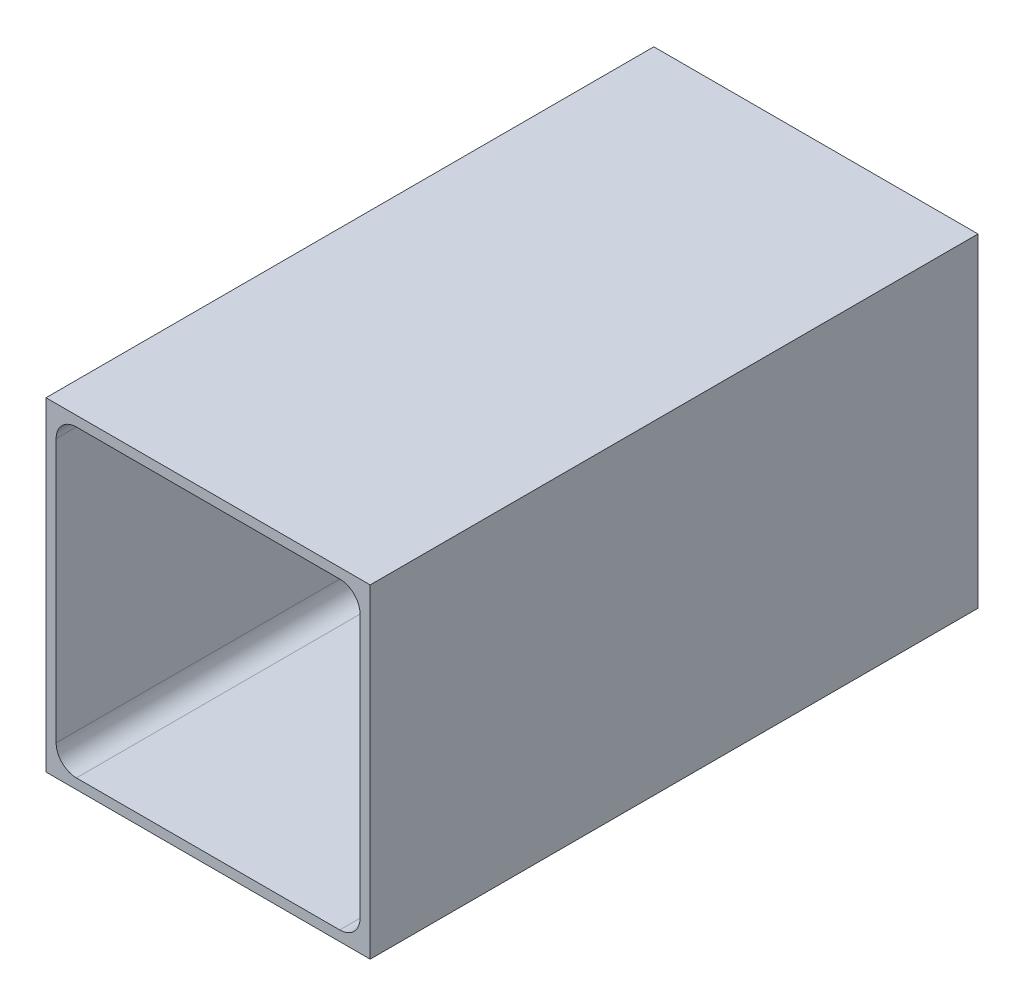
ISO-10303-21;
HEADER;
FILE_DESCRIPTION(('STEP AP214'),'2;1');
FILE_NAME('part.step','',(''),(''),'','','');
FILE_SCHEMA(('AUTOMOTIVE_DESIGN { 1 0 10303 214 1 1 1 1 }'));
ENDSEC;
DATA;
#1=APPLICATION_CONTEXT('core data for automotive mechanical design processes');
#2=APPLICATION_PROTOCOL_DEFINITION('international standard','automotive_design',2000,#1);
#3=PRODUCT_CONTEXT('',#1,'mechanical');
#4=PRODUCT('Part','Part','',(#3));
#5=PRODUCT_RELATED_PRODUCT_CATEGORY('part','',(#4));
#6=PRODUCT_DEFINITION_FORMATION('','',#4);
#7=PRODUCT_DEFINITION_CONTEXT('part definition',#1,'design');
#8=PRODUCT_DEFINITION('design','',#6,#7);
#9=PRODUCT_DEFINITION_SHAPE('','',#8);
#10=(LENGTH_UNIT() NAMED_UNIT(*) SI_UNIT(.MILLI.,.METRE.));
#11=(NAMED_UNIT(*) PLANE_ANGLE_UNIT() SI_UNIT($,.RADIAN.));
#12=(NAMED_UNIT(*) SI_UNIT($,.STERADIAN.) SOLID_ANGLE_UNIT());
#13=UNCERTAINTY_MEASURE_WITH_UNIT(LENGTH_MEASURE(1.E-05),#10,'distance_accuracy_value','');
#14=(GEOMETRIC_REPRESENTATION_CONTEXT(3) GLOBAL_UNCERTAINTY_ASSIGNED_CONTEXT((#13)) GLOBAL_UNIT_ASSIGNED_CONTEXT((#10,
#11,#12)) REPRESENTATION_CONTEXT('',''));
#15=CARTESIAN_POINT('',(0.,0.,0.));
#16=DIRECTION('',(0.,0.,1.));
#17=DIRECTION('',(1.,0.,0.));
#18=AXIS2_PLACEMENT_3D('',#15,#16,#17);
#19=CARTESIAN_POINT('',(0.,0.,3000.));
#20=DIRECTION('',(0.,0.,-1.));
#21=DIRECTION('',(-1.,0.,0.));
#22=AXIS2_PLACEMENT_3D('',#19,#20,#21);
#23=PLANE('',#22);
#24=DIRECTION('',(0.,-1.,0.));
#25=VECTOR('',#24,1.);
#26=CARTESIAN_POINT('',(-160.,0.,3000.));
#27=LINE('',#26,#25);
#28=CARTESIAN_POINT('',(-160.,160.,3000.));
#29=VERTEX_POINT('',#28);
#30=CARTESIAN_POINT('',(-160.,-160.,3000.));
#31=VERTEX_POINT('',#30);
#32=EDGE_CURVE('E145',#29,#31,#27,.T.);
#33=ORIENTED_EDGE('',*,*,#32,.T.);
#34=DIRECTION('',(1.,0.,0.));
#35=VECTOR('',#34,1.);
#36=CARTESIAN_POINT('',(0.,-160.,3000.));
#37=LINE('',#36,#35);
#38=CARTESIAN_POINT('',(160.,-160.,3000.));
#39=VERTEX_POINT('',#38);
#40=EDGE_CURVE('E154',#31,#39,#37,.T.);
#41=ORIENTED_EDGE('',*,*,#40,.T.);
#42=DIRECTION('',(0.,1.,0.));
#43=VECTOR('',#42,1.);
#44=CARTESIAN_POINT('',(160.,0.,3000.));
#45=LINE('',#44,#43);
#46=CARTESIAN_POINT('',(160.,160.,3000.));
#47=VERTEX_POINT('',#46);
#48=EDGE_CURVE('E161',#39,#47,#45,.T.);
#49=ORIENTED_EDGE('',*,*,#48,.T.);
#50=DIRECTION('',(-1.,0.,0.));
#51=VECTOR('',#50,1.);
#52=CARTESIAN_POINT('',(0.,160.,3000.));
#53=LINE('',#52,#51);
#54=EDGE_CURVE('E164',#47,#29,#53,.T.);
#55=ORIENTED_EDGE('',*,*,#54,.T.);
#56=EDGE_LOOP('',(#33,#41,#49,#55));
#57=FACE_BOUND('',#56,.T.);
#58=DIRECTION('',(0.,-1.,0.));
#59=VECTOR('',#58,1.);
#60=CARTESIAN_POINT('',(-150.,-150.,3000.));
#61=LINE('',#60,#59);
#62=CARTESIAN_POINT('',(-150.,130.,3000.));
#63=VERTEX_POINT('',#62);
#64=CARTESIAN_POINT('',(-150.,-130.,3000.));
#65=VERTEX_POINT('',#64);
#66=EDGE_CURVE('E232',#63,#65,#61,.T.);
#67=ORIENTED_EDGE('',*,*,#66,.F.);
#68=CARTESIAN_POINT('',(-130.,130.,3000.));
#69=DIRECTION('',(0.,0.,-1.));
#70=DIRECTION('',(-1.,0.,0.));
#71=AXIS2_PLACEMENT_3D('',#68,#69,#70);
#72=CIRCLE('',#71,20.);
#73=CARTESIAN_POINT('',(-130.,150.,3000.));
#74=VERTEX_POINT('',#73);
#75=EDGE_CURVE('E220',#63,#74,#72,.T.);
#76=ORIENTED_EDGE('',*,*,#75,.T.);
#77=DIRECTION('',(-1.,0.,0.));
#78=VECTOR('',#77,1.);
#79=CARTESIAN_POINT('',(-150.,150.,3000.));
#80=LINE('',#79,#78);
#81=CARTESIAN_POINT('',(130.,150.,3000.));
#82=VERTEX_POINT('',#81);
#83=EDGE_CURVE('E200',#82,#74,#80,.T.);
#84=ORIENTED_EDGE('',*,*,#83,.F.);
#85=CARTESIAN_POINT('',(130.,130.,3000.));
#86=DIRECTION('',(0.,0.,-1.));
#87=DIRECTION('',(-1.,0.,0.));
#88=AXIS2_PLACEMENT_3D('',#85,#86,#87);
#89=CIRCLE('',#88,20.);
#90=CARTESIAN_POINT('',(150.,130.,3000.));
#91=VERTEX_POINT('',#90);
#92=EDGE_CURVE('E224',#82,#91,#89,.T.);
#93=ORIENTED_EDGE('',*,*,#92,.T.);
#94=DIRECTION('',(0.,1.,0.));
#95=VECTOR('',#94,1.);
#96=CARTESIAN_POINT('',(150.,-150.,3000.));
#97=LINE('',#96,#95);
#98=CARTESIAN_POINT('',(150.,-130.,3000.));
#99=VERTEX_POINT('',#98);
#100=EDGE_CURVE('E196',#99,#91,#97,.T.);
#101=ORIENTED_EDGE('',*,*,#100,.F.);
#102=CARTESIAN_POINT('',(130.,-130.,3000.));
#103=DIRECTION('',(0.,0.,-1.));
#104=DIRECTION('',(-1.,0.,0.));
#105=AXIS2_PLACEMENT_3D('',#102,#103,#104);
#106=CIRCLE('',#105,20.);
#107=CARTESIAN_POINT('',(130.,-150.,3000.));
#108=VERTEX_POINT('',#107);
#109=EDGE_CURVE('E66',#99,#108,#106,.T.);
#110=ORIENTED_EDGE('',*,*,#109,.T.);
#111=DIRECTION('',(1.,0.,0.));
#112=VECTOR('',#111,1.);
#113=CARTESIAN_POINT('',(-150.,-150.,3000.));
#114=LINE('',#113,#112);
#115=CARTESIAN_POINT('',(-130.,-150.,3000.));
#116=VERTEX_POINT('',#115);
#117=EDGE_CURVE('E182',#116,#108,#114,.T.);
#118=ORIENTED_EDGE('',*,*,#117,.F.);
#119=CARTESIAN_POINT('',(-130.,-130.,3000.));
#120=DIRECTION('',(0.,0.,-1.));
#121=DIRECTION('',(-1.,0.,0.));
#122=AXIS2_PLACEMENT_3D('',#119,#120,#121);
#123=CIRCLE('',#122,20.);
#124=EDGE_CURVE('E59',#116,#65,#123,.T.);
#125=ORIENTED_EDGE('',*,*,#124,.T.);
#126=EDGE_LOOP('',(#67,#76,#84,#93,#101,#110,#118,#125));
#127=FACE_BOUND('',#126,.T.);
#128=ADVANCED_FACE('F51',(#57,#127),#23,.F.);
#129=CARTESIAN_POINT('',(0.,0.,2400.));
#130=DIRECTION('',(0.,0.,1.));
#131=DIRECTION('',(1.,0.,0.));
#132=AXIS2_PLACEMENT_3D('',#129,#130,#131);
#133=PLANE('',#132);
#134=DIRECTION('',(1.,0.,0.));
#135=VECTOR('',#134,1.);
#136=CARTESIAN_POINT('',(0.,-160.,2400.));
#137=LINE('',#136,#135);
#138=CARTESIAN_POINT('',(-160.,-160.,2400.));
#139=VERTEX_POINT('',#138);
#140=CARTESIAN_POINT('',(160.,-160.,2400.));
#141=VERTEX_POINT('',#140);
#142=EDGE_CURVE('E180',#139,#141,#137,.T.);
#143=ORIENTED_EDGE('',*,*,#142,.F.);
#144=DIRECTION('',(0.,-1.,0.));
#145=VECTOR('',#144,1.);
#146=CARTESIAN_POINT('',(-160.,0.,2400.));
#147=LINE('',#146,#145);
#148=CARTESIAN_POINT('',(-160.,160.,2400.));
#149=VERTEX_POINT('',#148);
#150=EDGE_CURVE('E147',#149,#139,#147,.T.);
#151=ORIENTED_EDGE('',*,*,#150,.F.);
#152=DIRECTION('',(-1.,0.,0.));
#153=VECTOR('',#152,1.);
#154=CARTESIAN_POINT('',(0.,160.,2400.));
#155=LINE('',#154,#153);
#156=CARTESIAN_POINT('',(160.,160.,2400.));
#157=VERTEX_POINT('',#156);
#158=EDGE_CURVE('E174',#157,#149,#155,.T.);
#159=ORIENTED_EDGE('',*,*,#158,.F.);
#160=DIRECTION('',(0.,1.,0.));
#161=VECTOR('',#160,1.);
#162=CARTESIAN_POINT('',(160.,0.,2400.));
#163=LINE('',#162,#161);
#164=EDGE_CURVE('E177',#141,#157,#163,.T.);
#165=ORIENTED_EDGE('',*,*,#164,.F.);
#166=EDGE_LOOP('',(#143,#151,#159,#165));
#167=FACE_BOUND('',#166,.T.);
#168=DIRECTION('',(0.,-1.,0.));
#169=VECTOR('',#168,1.);
#170=CARTESIAN_POINT('',(-150.,-150.,2400.));
#171=LINE('',#170,#169);
#172=CARTESIAN_POINT('',(-150.,130.,2400.));
#173=VERTEX_POINT('',#172);
#174=CARTESIAN_POINT('',(-150.,-130.,2400.));
#175=VERTEX_POINT('',#174);
#176=EDGE_CURVE('E240',#173,#175,#171,.T.);
#177=ORIENTED_EDGE('',*,*,#176,.T.);
#178=CARTESIAN_POINT('',(-130.,-130.,2400.));
#179=DIRECTION('',(0.,0.,1.));
#180=DIRECTION('',(1.,0.,0.));
#181=AXIS2_PLACEMENT_3D('',#178,#179,#180);
#182=CIRCLE('',#181,20.);
#183=CARTESIAN_POINT('',(-130.,-150.,2400.));
#184=VERTEX_POINT('',#183);
#185=EDGE_CURVE('E12',#175,#184,#182,.T.);
#186=ORIENTED_EDGE('',*,*,#185,.T.);
#187=DIRECTION('',(1.,0.,0.));
#188=VECTOR('',#187,1.);
#189=CARTESIAN_POINT('',(-150.,-150.,2400.));
#190=LINE('',#189,#188);
#191=CARTESIAN_POINT('',(130.,-150.,2400.));
#192=VERTEX_POINT('',#191);
#193=EDGE_CURVE('E193',#184,#192,#190,.T.);
#194=ORIENTED_EDGE('',*,*,#193,.T.);
#195=CARTESIAN_POINT('',(130.,-130.,2400.));
#196=DIRECTION('',(0.,0.,1.));
#197=DIRECTION('',(1.,0.,0.));
#198=AXIS2_PLACEMENT_3D('',#195,#196,#197);
#199=CIRCLE('',#198,20.);
#200=CARTESIAN_POINT('',(150.,-130.,2400.));
#201=VERTEX_POINT('',#200);
#202=EDGE_CURVE('E229',#192,#201,#199,.T.);
#203=ORIENTED_EDGE('',*,*,#202,.T.);
#204=DIRECTION('',(0.,1.,0.));
#205=VECTOR('',#204,1.);
#206=CARTESIAN_POINT('',(150.,-150.,2400.));
#207=LINE('',#206,#205);
#208=CARTESIAN_POINT('',(150.,130.,2400.));
#209=VERTEX_POINT('',#208);
#210=EDGE_CURVE('E188',#201,#209,#207,.T.);
#211=ORIENTED_EDGE('',*,*,#210,.T.);
#212=CARTESIAN_POINT('',(130.,130.,2400.));
#213=DIRECTION('',(0.,0.,1.));
#214=DIRECTION('',(1.,0.,0.));
#215=AXIS2_PLACEMENT_3D('',#212,#213,#214);
#216=CIRCLE('',#215,20.);
#217=CARTESIAN_POINT('',(130.,150.,2400.));
#218=VERTEX_POINT('',#217);
#219=EDGE_CURVE('E226',#209,#218,#216,.T.);
#220=ORIENTED_EDGE('',*,*,#219,.T.);
#221=DIRECTION('',(-1.,0.,0.));
#222=VECTOR('',#221,1.);
#223=CARTESIAN_POINT('',(-150.,150.,2400.));
#224=LINE('',#223,#222);
#225=CARTESIAN_POINT('',(-130.,150.,2400.));
#226=VERTEX_POINT('',#225);
#227=EDGE_CURVE('E192',#218,#226,#224,.T.);
#228=ORIENTED_EDGE('',*,*,#227,.T.);
#229=CARTESIAN_POINT('',(-130.,130.,2400.));
#230=DIRECTION('',(0.,0.,1.));
#231=DIRECTION('',(1.,0.,0.));
#232=AXIS2_PLACEMENT_3D('',#229,#230,#231);
#233=CIRCLE('',#232,20.);
#234=EDGE_CURVE('E222',#226,#173,#233,.T.);
#235=ORIENTED_EDGE('',*,*,#234,.T.);
#236=EDGE_LOOP('',(#177,#186,#194,#203,#211,#220,#228,#235));
#237=FACE_BOUND('',#236,.T.);
#238=ADVANCED_FACE('F265',(#167,#237),#133,.F.);
#239=CARTESIAN_POINT('',(-160.,0.,0.));
#240=DIRECTION('',(1.,0.,0.));
#241=DIRECTION('',(0.,1.,0.));
#242=AXIS2_PLACEMENT_3D('',#239,#240,#241);
#243=PLANE('',#242);
#244=DIRECTION('',(0.,0.,1.));
#245=VECTOR('',#244,1.);
#246=CARTESIAN_POINT('',(-160.,-160.,0.));
#247=LINE('',#246,#245);
#248=EDGE_CURVE('E140',#139,#31,#247,.T.);
#249=ORIENTED_EDGE('',*,*,#248,.T.);
#250=ORIENTED_EDGE('',*,*,#32,.F.);
#251=DIRECTION('',(0.,0.,1.));
#252=VECTOR('',#251,1.);
#253=CARTESIAN_POINT('',(-160.,160.,0.));
#254=LINE('',#253,#252);
#255=EDGE_CURVE('E151',#149,#29,#254,.T.);
#256=ORIENTED_EDGE('',*,*,#255,.F.);
#257=ORIENTED_EDGE('',*,*,#150,.T.);
#258=EDGE_LOOP('',(#249,#250,#256,#257));
#259=FACE_BOUND('',#258,.T.);
#260=ADVANCED_FACE('F142',(#259),#243,.F.);
#261=CARTESIAN_POINT('',(0.,160.,0.));
#262=DIRECTION('',(0.,-1.,0.));
#263=DIRECTION('',(1.,0.,0.));
#264=AXIS2_PLACEMENT_3D('',#261,#262,#263);
#265=PLANE('',#264);
#266=ORIENTED_EDGE('',*,*,#255,.T.);
#267=ORIENTED_EDGE('',*,*,#54,.F.);
#268=DIRECTION('',(0.,0.,1.));
#269=VECTOR('',#268,1.);
#270=CARTESIAN_POINT('',(160.,160.,0.));
#271=LINE('',#270,#269);
#272=EDGE_CURVE('E165',#157,#47,#271,.T.);
#273=ORIENTED_EDGE('',*,*,#272,.F.);
#274=ORIENTED_EDGE('',*,*,#158,.T.);
#275=EDGE_LOOP('',(#266,#267,#273,#274));
#276=FACE_BOUND('',#275,.T.);
#277=ADVANCED_FACE('F299',(#276),#265,.F.);
#278=CARTESIAN_POINT('',(0.,-160.,0.));
#279=DIRECTION('',(0.,1.,0.));
#280=DIRECTION('',(-1.,0.,0.));
#281=AXIS2_PLACEMENT_3D('',#278,#279,#280);
#282=PLANE('',#281);
#283=DIRECTION('',(0.,0.,1.));
#284=VECTOR('',#283,1.);
#285=CARTESIAN_POINT('',(160.,-160.,0.));
#286=LINE('',#285,#284);
#287=EDGE_CURVE('E157',#141,#39,#286,.T.);
#288=ORIENTED_EDGE('',*,*,#287,.T.);
#289=ORIENTED_EDGE('',*,*,#40,.F.);
#290=ORIENTED_EDGE('',*,*,#248,.F.);
#291=ORIENTED_EDGE('',*,*,#142,.T.);
#292=EDGE_LOOP('',(#288,#289,#290,#291));
#293=FACE_BOUND('',#292,.T.);
#294=ADVANCED_FACE('F155',(#293),#282,.F.);
#295=CARTESIAN_POINT('',(160.,0.,0.));
#296=DIRECTION('',(-1.,0.,0.));
#297=DIRECTION('',(0.,-1.,0.));
#298=AXIS2_PLACEMENT_3D('',#295,#296,#297);
#299=PLANE('',#298);
#300=ORIENTED_EDGE('',*,*,#272,.T.);
#301=ORIENTED_EDGE('',*,*,#48,.F.);
#302=ORIENTED_EDGE('',*,*,#287,.F.);
#303=ORIENTED_EDGE('',*,*,#164,.T.);
#304=EDGE_LOOP('',(#300,#301,#302,#303));
#305=FACE_BOUND('',#304,.T.);
#306=ADVANCED_FACE('F305',(#305),#299,.F.);
#307=CARTESIAN_POINT('',(-150.,0.,0.));
#308=DIRECTION('',(1.,0.,0.));
#309=DIRECTION('',(0.,1.,0.));
#310=AXIS2_PLACEMENT_3D('',#307,#308,#309);
#311=PLANE('',#310);
#312=ORIENTED_EDGE('',*,*,#176,.F.);
#313=DIRECTION('',(0.,0.,1.));
#314=VECTOR('',#313,1.);
#315=CARTESIAN_POINT('',(-150.,130.,3000.));
#316=LINE('',#315,#314);
#317=EDGE_CURVE('E239',#173,#63,#316,.T.);
#318=ORIENTED_EDGE('',*,*,#317,.T.);
#319=ORIENTED_EDGE('',*,*,#66,.T.);
#320=DIRECTION('',(0.,0.,1.));
#321=VECTOR('',#320,1.);
#322=CARTESIAN_POINT('',(-150.,-130.,2400.));
#323=LINE('',#322,#321);
#324=EDGE_CURVE('E160',#65,#175,#323,.F.);
#325=ORIENTED_EDGE('',*,*,#324,.T.);
#326=EDGE_LOOP('',(#312,#318,#319,#325));
#327=FACE_BOUND('',#326,.T.);
#328=ADVANCED_FACE('F236',(#327),#311,.T.);
#329=CARTESIAN_POINT('',(0.,150.,0.));
#330=DIRECTION('',(0.,-1.,0.));
#331=DIRECTION('',(1.,0.,0.));
#332=AXIS2_PLACEMENT_3D('',#329,#330,#331);
#333=PLANE('',#332);
#334=ORIENTED_EDGE('',*,*,#83,.T.);
#335=DIRECTION('',(0.,0.,1.));
#336=VECTOR('',#335,1.);
#337=CARTESIAN_POINT('',(-130.,150.,2400.));
#338=LINE('',#337,#336);
#339=EDGE_CURVE('E194',#74,#226,#338,.F.);
#340=ORIENTED_EDGE('',*,*,#339,.T.);
#341=ORIENTED_EDGE('',*,*,#227,.F.);
#342=DIRECTION('',(0.,0.,1.));
#343=VECTOR('',#342,1.);
#344=CARTESIAN_POINT('',(130.,150.,3000.));
#345=LINE('',#344,#343);
#346=EDGE_CURVE('E244',#218,#82,#345,.T.);
#347=ORIENTED_EDGE('',*,*,#346,.T.);
#348=EDGE_LOOP('',(#334,#340,#341,#347));
#349=FACE_BOUND('',#348,.T.);
#350=ADVANCED_FACE('F269',(#349),#333,.T.);
#351=CARTESIAN_POINT('',(0.,-150.,0.));
#352=DIRECTION('',(0.,1.,0.));
#353=DIRECTION('',(-1.,0.,0.));
#354=AXIS2_PLACEMENT_3D('',#351,#352,#353);
#355=PLANE('',#354);
#356=ORIENTED_EDGE('',*,*,#117,.T.);
#357=DIRECTION('',(0.,0.,1.));
#358=VECTOR('',#357,1.);
#359=CARTESIAN_POINT('',(130.,-150.,2400.));
#360=LINE('',#359,#358);
#361=EDGE_CURVE('E217',#108,#192,#360,.F.);
#362=ORIENTED_EDGE('',*,*,#361,.T.);
#363=ORIENTED_EDGE('',*,*,#193,.F.);
#364=DIRECTION('',(0.,0.,1.));
#365=VECTOR('',#364,1.);
#366=CARTESIAN_POINT('',(-130.,-150.,3000.));
#367=LINE('',#366,#365);
#368=EDGE_CURVE('E215',#184,#116,#367,.T.);
#369=ORIENTED_EDGE('',*,*,#368,.T.);
#370=EDGE_LOOP('',(#356,#362,#363,#369));
#371=FACE_BOUND('',#370,.T.);
#372=ADVANCED_FACE('F277',(#371),#355,.T.);
#373=CARTESIAN_POINT('',(150.,0.,0.));
#374=DIRECTION('',(-1.,0.,0.));
#375=DIRECTION('',(0.,-1.,0.));
#376=AXIS2_PLACEMENT_3D('',#373,#374,#375);
#377=PLANE('',#376);
#378=ORIENTED_EDGE('',*,*,#100,.T.);
#379=DIRECTION('',(0.,0.,1.));
#380=VECTOR('',#379,1.);
#381=CARTESIAN_POINT('',(150.,130.,2400.));
#382=LINE('',#381,#380);
#383=EDGE_CURVE('E218',#91,#209,#382,.F.);
#384=ORIENTED_EDGE('',*,*,#383,.T.);
#385=ORIENTED_EDGE('',*,*,#210,.F.);
#386=DIRECTION('',(0.,0.,1.));
#387=VECTOR('',#386,1.);
#388=CARTESIAN_POINT('',(150.,-130.,3000.));
#389=LINE('',#388,#387);
#390=EDGE_CURVE('E201',#201,#99,#389,.T.);
#391=ORIENTED_EDGE('',*,*,#390,.T.);
#392=EDGE_LOOP('',(#378,#384,#385,#391));
#393=FACE_BOUND('',#392,.T.);
#394=ADVANCED_FACE('F261',(#393),#377,.T.);
#395=CARTESIAN_POINT('',(-130.,130.,0.));
#396=DIRECTION('',(0.,0.,-1.));
#397=DIRECTION('',(-1.,0.,0.));
#398=AXIS2_PLACEMENT_3D('',#395,#396,#397);
#399=CYLINDRICAL_SURFACE('',#398,20.);
#400=ORIENTED_EDGE('',*,*,#234,.F.);
#401=ORIENTED_EDGE('',*,*,#339,.F.);
#402=ORIENTED_EDGE('',*,*,#75,.F.);
#403=ORIENTED_EDGE('',*,*,#317,.F.);
#404=EDGE_LOOP('',(#400,#401,#402,#403));
#405=FACE_BOUND('',#404,.T.);
#406=ADVANCED_FACE('F272',(#405),#399,.F.);
#407=CARTESIAN_POINT('',(130.,130.,0.));
#408=DIRECTION('',(0.,0.,-1.));
#409=DIRECTION('',(0.,1.,0.));
#410=AXIS2_PLACEMENT_3D('',#407,#408,#409);
#411=CYLINDRICAL_SURFACE('',#410,20.);
#412=ORIENTED_EDGE('',*,*,#219,.F.);
#413=ORIENTED_EDGE('',*,*,#383,.F.);
#414=ORIENTED_EDGE('',*,*,#92,.F.);
#415=ORIENTED_EDGE('',*,*,#346,.F.);
#416=EDGE_LOOP('',(#412,#413,#414,#415));
#417=FACE_BOUND('',#416,.T.);
#418=ADVANCED_FACE('F268',(#417),#411,.F.);
#419=CARTESIAN_POINT('',(130.,-130.,0.));
#420=DIRECTION('',(0.,0.,-1.));
#421=DIRECTION('',(0.,1.,0.));
#422=AXIS2_PLACEMENT_3D('',#419,#420,#421);
#423=CYLINDRICAL_SURFACE('',#422,20.);
#424=ORIENTED_EDGE('',*,*,#202,.F.);
#425=ORIENTED_EDGE('',*,*,#361,.F.);
#426=ORIENTED_EDGE('',*,*,#109,.F.);
#427=ORIENTED_EDGE('',*,*,#390,.F.);
#428=EDGE_LOOP('',(#424,#425,#426,#427));
#429=FACE_BOUND('',#428,.T.);
#430=ADVANCED_FACE('F280',(#429),#423,.F.);
#431=CARTESIAN_POINT('',(-130.,-130.,0.));
#432=DIRECTION('',(0.,0.,-1.));
#433=DIRECTION('',(-1.,0.,0.));
#434=AXIS2_PLACEMENT_3D('',#431,#432,#433);
#435=CYLINDRICAL_SURFACE('',#434,20.);
#436=ORIENTED_EDGE('',*,*,#185,.F.);
#437=ORIENTED_EDGE('',*,*,#324,.F.);
#438=ORIENTED_EDGE('',*,*,#124,.F.);
#439=ORIENTED_EDGE('',*,*,#368,.F.);
#440=EDGE_LOOP('',(#436,#437,#438,#439));
#441=FACE_BOUND('',#440,.T.);
#442=ADVANCED_FACE('F53',(#441),#435,.F.);
#443=CLOSED_SHELL('',(#128,#238,#260,#277,#294,#306,#328,#350,#372,#394,#406,#418,#430,#442));
#444=MANIFOLD_SOLID_BREP('B2',#443);
#445=ADVANCED_BREP_SHAPE_REPRESENTATION('',(#18,#444),#14);
#446=SHAPE_DEFINITION_REPRESENTATION(#9,#445);
ENDSEC;
END-ISO-10303-21;
